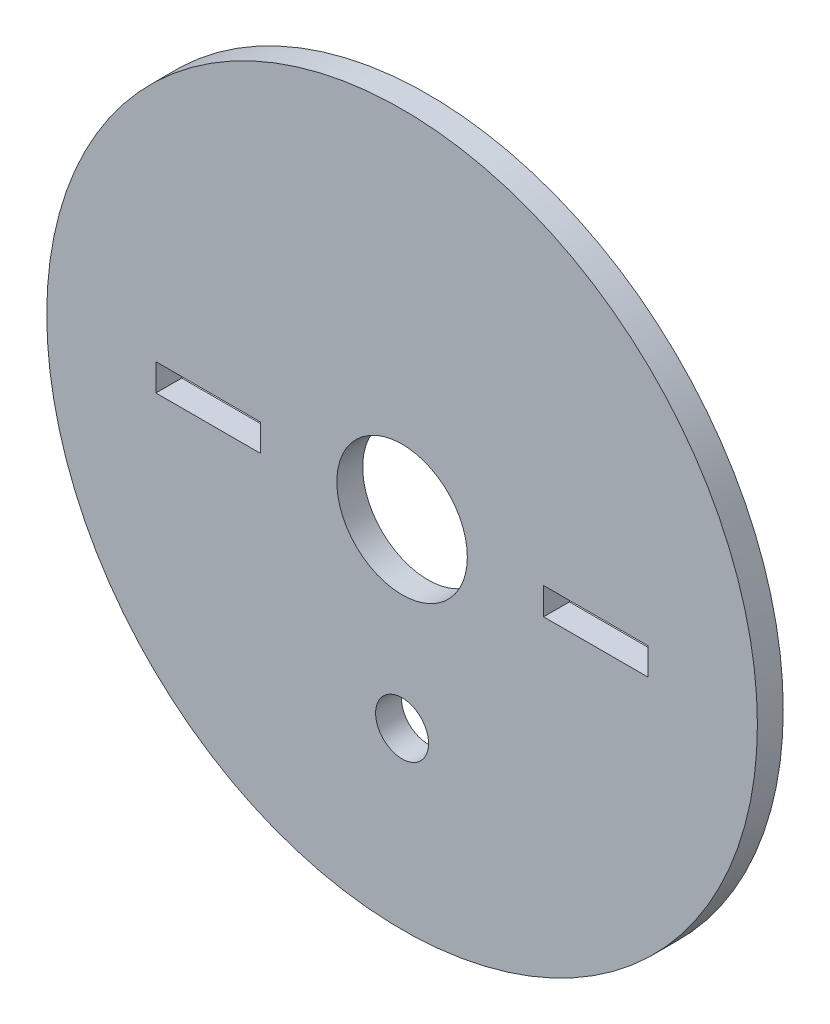
ISO-10303-21;
HEADER;
FILE_DESCRIPTION(('STEP AP214'),'2;1');
FILE_NAME('part.step','',(''),(''),'','','');
FILE_SCHEMA(('AUTOMOTIVE_DESIGN { 1 0 10303 214 1 1 1 1 }'));
ENDSEC;
DATA;
#1=APPLICATION_CONTEXT('core data for automotive mechanical design processes');
#2=APPLICATION_PROTOCOL_DEFINITION('international standard','automotive_design',2000,#1);
#3=PRODUCT_CONTEXT('',#1,'mechanical');
#4=PRODUCT('Part','Part','',(#3));
#5=PRODUCT_RELATED_PRODUCT_CATEGORY('part','',(#4));
#6=PRODUCT_DEFINITION_FORMATION('','',#4);
#7=PRODUCT_DEFINITION_CONTEXT('part definition',#1,'design');
#8=PRODUCT_DEFINITION('design','',#6,#7);
#9=PRODUCT_DEFINITION_SHAPE('','',#8);
#10=(LENGTH_UNIT() NAMED_UNIT(*) SI_UNIT(.MILLI.,.METRE.));
#11=(NAMED_UNIT(*) PLANE_ANGLE_UNIT() SI_UNIT($,.RADIAN.));
#12=(NAMED_UNIT(*) SI_UNIT($,.STERADIAN.) SOLID_ANGLE_UNIT());
#13=UNCERTAINTY_MEASURE_WITH_UNIT(LENGTH_MEASURE(1.E-05),#10,'distance_accuracy_value','');
#14=(GEOMETRIC_REPRESENTATION_CONTEXT(3) GLOBAL_UNCERTAINTY_ASSIGNED_CONTEXT((#13)) GLOBAL_UNIT_ASSIGNED_CONTEXT((#10,
#11,#12)) REPRESENTATION_CONTEXT('',''));
#15=CARTESIAN_POINT('',(0.,0.,0.));
#16=DIRECTION('',(0.,0.,1.));
#17=DIRECTION('',(1.,0.,0.));
#18=AXIS2_PLACEMENT_3D('',#15,#16,#17);
#19=CARTESIAN_POINT('',(0.,14.,2.));
#20=DIRECTION('',(0.,0.,1.));
#21=DIRECTION('',(1.,0.,0.));
#22=AXIS2_PLACEMENT_3D('',#19,#20,#21);
#23=PLANE('',#22);
#24=DIRECTION('',(0.,-1.,0.));
#25=VECTOR('',#24,1.);
#26=CARTESIAN_POINT('',(10.95,15.05,2.));
#27=LINE('',#26,#25);
#28=CARTESIAN_POINT('',(10.95,15.05,2.));
#29=VERTEX_POINT('',#28);
#30=CARTESIAN_POINT('',(10.95,12.95,2.));
#31=VERTEX_POINT('',#30);
#32=EDGE_CURVE('E108',#29,#31,#27,.T.);
#33=ORIENTED_EDGE('',*,*,#32,.F.);
#34=DIRECTION('',(-1.,0.,0.));
#35=VECTOR('',#34,1.);
#36=CARTESIAN_POINT('',(19.05,15.05,2.));
#37=LINE('',#36,#35);
#38=CARTESIAN_POINT('',(19.05,15.05,2.));
#39=VERTEX_POINT('',#38);
#40=EDGE_CURVE('E100',#39,#29,#37,.T.);
#41=ORIENTED_EDGE('',*,*,#40,.F.);
#42=DIRECTION('',(0.,1.,0.));
#43=VECTOR('',#42,1.);
#44=CARTESIAN_POINT('',(19.05,15.05,2.));
#45=LINE('',#44,#43);
#46=CARTESIAN_POINT('',(19.05,12.95,2.));
#47=VERTEX_POINT('',#46);
#48=EDGE_CURVE('E123',#47,#39,#45,.T.);
#49=ORIENTED_EDGE('',*,*,#48,.F.);
#50=DIRECTION('',(1.,0.,0.));
#51=VECTOR('',#50,1.);
#52=CARTESIAN_POINT('',(19.05,12.95,2.));
#53=LINE('',#52,#51);
#54=EDGE_CURVE('E121',#31,#47,#53,.T.);
#55=ORIENTED_EDGE('',*,*,#54,.F.);
#56=EDGE_LOOP('',(#33,#41,#49,#55));
#57=FACE_BOUND('',#56,.T.);
#58=DIRECTION('',(-1.,0.,0.));
#59=VECTOR('',#58,1.);
#60=CARTESIAN_POINT('',(-19.05,15.05,2.));
#61=LINE('',#60,#59);
#62=CARTESIAN_POINT('',(-10.95,15.05,2.));
#63=VERTEX_POINT('',#62);
#64=CARTESIAN_POINT('',(-19.05,15.05,2.));
#65=VERTEX_POINT('',#64);
#66=EDGE_CURVE('E141',#63,#65,#61,.T.);
#67=ORIENTED_EDGE('',*,*,#66,.F.);
#68=DIRECTION('',(0.,1.,0.));
#69=VECTOR('',#68,1.);
#70=CARTESIAN_POINT('',(-10.95,15.05,2.));
#71=LINE('',#70,#69);
#72=CARTESIAN_POINT('',(-10.95,12.95,2.));
#73=VERTEX_POINT('',#72);
#74=EDGE_CURVE('E139',#73,#63,#71,.T.);
#75=ORIENTED_EDGE('',*,*,#74,.F.);
#76=DIRECTION('',(1.,0.,0.));
#77=VECTOR('',#76,1.);
#78=CARTESIAN_POINT('',(-19.05,12.95,2.));
#79=LINE('',#78,#77);
#80=CARTESIAN_POINT('',(-19.05,12.95,2.));
#81=VERTEX_POINT('',#80);
#82=EDGE_CURVE('E147',#81,#73,#79,.T.);
#83=ORIENTED_EDGE('',*,*,#82,.F.);
#84=DIRECTION('',(0.,-1.,0.));
#85=VECTOR('',#84,1.);
#86=CARTESIAN_POINT('',(-19.05,15.05,2.));
#87=LINE('',#86,#85);
#88=EDGE_CURVE('E144',#65,#81,#87,.T.);
#89=ORIENTED_EDGE('',*,*,#88,.F.);
#90=EDGE_LOOP('',(#67,#75,#83,#89));
#91=FACE_BOUND('',#90,.T.);
#92=CARTESIAN_POINT('',(0.,0.,2.));
#93=DIRECTION('',(0.,0.,1.));
#94=DIRECTION('',(1.,0.,0.));
#95=AXIS2_PLACEMENT_3D('',#92,#93,#94);
#96=CIRCLE('',#95,2.05);
#97=CARTESIAN_POINT('',(2.05,0.,2.));
#98=VERTEX_POINT('',#97);
#99=EDGE_CURVE('E170',#98,#98,#96,.T.);
#100=ORIENTED_EDGE('',*,*,#99,.F.);
#101=EDGE_LOOP('',(#100));
#102=FACE_BOUND('',#101,.T.);
#103=CARTESIAN_POINT('',(0.,14.,2.));
#104=DIRECTION('',(0.,0.,1.));
#105=DIRECTION('',(1.,0.,0.));
#106=AXIS2_PLACEMENT_3D('',#103,#104,#105);
#107=CIRCLE('',#106,27.5);
#108=CARTESIAN_POINT('',(27.5,14.,2.));
#109=VERTEX_POINT('',#108);
#110=EDGE_CURVE('E11',#109,#109,#107,.T.);
#111=ORIENTED_EDGE('',*,*,#110,.T.);
#112=EDGE_LOOP('',(#111));
#113=FACE_BOUND('',#112,.T.);
#114=CARTESIAN_POINT('',(0.,14.,2.));
#115=DIRECTION('',(0.,0.,1.));
#116=DIRECTION('',(1.,0.,0.));
#117=AXIS2_PLACEMENT_3D('',#114,#115,#116);
#118=CIRCLE('',#117,5.05);
#119=CARTESIAN_POINT('',(5.05,14.,2.));
#120=VERTEX_POINT('',#119);
#121=EDGE_CURVE('E129',#120,#120,#118,.T.);
#122=ORIENTED_EDGE('',*,*,#121,.F.);
#123=EDGE_LOOP('',(#122));
#124=FACE_BOUND('',#123,.T.);
#125=ADVANCED_FACE('F35',(#57,#91,#102,#113,#124),#23,.T.);
#126=CARTESIAN_POINT('',(0.,14.,0.));
#127=DIRECTION('',(0.,0.,1.));
#128=DIRECTION('',(1.,0.,0.));
#129=AXIS2_PLACEMENT_3D('',#126,#127,#128);
#130=PLANE('',#129);
#131=DIRECTION('',(0.,1.,0.));
#132=VECTOR('',#131,1.);
#133=CARTESIAN_POINT('',(-10.95,15.05,0.));
#134=LINE('',#133,#132);
#135=CARTESIAN_POINT('',(-10.95,12.95,0.));
#136=VERTEX_POINT('',#135);
#137=CARTESIAN_POINT('',(-10.95,15.05,0.));
#138=VERTEX_POINT('',#137);
#139=EDGE_CURVE('E116',#136,#138,#134,.T.);
#140=ORIENTED_EDGE('',*,*,#139,.T.);
#141=DIRECTION('',(-1.,0.,0.));
#142=VECTOR('',#141,1.);
#143=CARTESIAN_POINT('',(-19.05,15.05,0.));
#144=LINE('',#143,#142);
#145=CARTESIAN_POINT('',(-19.05,15.05,0.));
#146=VERTEX_POINT('',#145);
#147=EDGE_CURVE('E152',#138,#146,#144,.T.);
#148=ORIENTED_EDGE('',*,*,#147,.T.);
#149=DIRECTION('',(0.,-1.,0.));
#150=VECTOR('',#149,1.);
#151=CARTESIAN_POINT('',(-19.05,15.05,0.));
#152=LINE('',#151,#150);
#153=CARTESIAN_POINT('',(-19.05,12.95,0.));
#154=VERTEX_POINT('',#153);
#155=EDGE_CURVE('E155',#146,#154,#152,.T.);
#156=ORIENTED_EDGE('',*,*,#155,.T.);
#157=DIRECTION('',(1.,0.,0.));
#158=VECTOR('',#157,1.);
#159=CARTESIAN_POINT('',(-19.05,12.95,0.));
#160=LINE('',#159,#158);
#161=EDGE_CURVE('E142',#154,#136,#160,.T.);
#162=ORIENTED_EDGE('',*,*,#161,.T.);
#163=EDGE_LOOP('',(#140,#148,#156,#162));
#164=FACE_BOUND('',#163,.T.);
#165=CARTESIAN_POINT('',(0.,14.,0.));
#166=DIRECTION('',(0.,0.,1.));
#167=DIRECTION('',(1.,0.,0.));
#168=AXIS2_PLACEMENT_3D('',#165,#166,#167);
#169=CIRCLE('',#168,27.5);
#170=CARTESIAN_POINT('',(27.5,14.,0.));
#171=VERTEX_POINT('',#170);
#172=EDGE_CURVE('E39',#171,#171,#169,.T.);
#173=ORIENTED_EDGE('',*,*,#172,.F.);
#174=EDGE_LOOP('',(#173));
#175=FACE_BOUND('',#174,.T.);
#176=CARTESIAN_POINT('',(0.,0.,0.));
#177=DIRECTION('',(0.,0.,1.));
#178=DIRECTION('',(1.,0.,0.));
#179=AXIS2_PLACEMENT_3D('',#176,#177,#178);
#180=CIRCLE('',#179,2.05);
#181=CARTESIAN_POINT('',(2.05,0.,0.));
#182=VERTEX_POINT('',#181);
#183=EDGE_CURVE('E169',#182,#182,#180,.T.);
#184=ORIENTED_EDGE('',*,*,#183,.T.);
#185=EDGE_LOOP('',(#184));
#186=FACE_BOUND('',#185,.T.);
#187=DIRECTION('',(-1.,0.,0.));
#188=VECTOR('',#187,1.);
#189=CARTESIAN_POINT('',(19.05,15.05,0.));
#190=LINE('',#189,#188);
#191=CARTESIAN_POINT('',(19.05,15.05,0.));
#192=VERTEX_POINT('',#191);
#193=CARTESIAN_POINT('',(10.95,15.05,0.));
#194=VERTEX_POINT('',#193);
#195=EDGE_CURVE('E58',#192,#194,#190,.T.);
#196=ORIENTED_EDGE('',*,*,#195,.T.);
#197=DIRECTION('',(0.,-1.,0.));
#198=VECTOR('',#197,1.);
#199=CARTESIAN_POINT('',(10.95,15.05,0.));
#200=LINE('',#199,#198);
#201=CARTESIAN_POINT('',(10.95,12.95,0.));
#202=VERTEX_POINT('',#201);
#203=EDGE_CURVE('E115',#194,#202,#200,.T.);
#204=ORIENTED_EDGE('',*,*,#203,.T.);
#205=DIRECTION('',(1.,0.,0.));
#206=VECTOR('',#205,1.);
#207=CARTESIAN_POINT('',(19.05,12.95,0.));
#208=LINE('',#207,#206);
#209=CARTESIAN_POINT('',(19.05,12.95,0.));
#210=VERTEX_POINT('',#209);
#211=EDGE_CURVE('E131',#202,#210,#208,.T.);
#212=ORIENTED_EDGE('',*,*,#211,.T.);
#213=DIRECTION('',(0.,1.,0.));
#214=VECTOR('',#213,1.);
#215=CARTESIAN_POINT('',(19.05,15.05,0.));
#216=LINE('',#215,#214);
#217=EDGE_CURVE('E109',#210,#192,#216,.T.);
#218=ORIENTED_EDGE('',*,*,#217,.T.);
#219=EDGE_LOOP('',(#196,#204,#212,#218));
#220=FACE_BOUND('',#219,.T.);
#221=CARTESIAN_POINT('',(0.,14.,0.));
#222=DIRECTION('',(0.,0.,1.));
#223=DIRECTION('',(1.,0.,0.));
#224=AXIS2_PLACEMENT_3D('',#221,#222,#223);
#225=CIRCLE('',#224,5.05);
#226=CARTESIAN_POINT('',(5.05,14.,0.));
#227=VERTEX_POINT('',#226);
#228=EDGE_CURVE('E249',#227,#227,#225,.T.);
#229=ORIENTED_EDGE('',*,*,#228,.T.);
#230=EDGE_LOOP('',(#229));
#231=FACE_BOUND('',#230,.T.);
#232=ADVANCED_FACE('F176',(#164,#175,#186,#220,#231),#130,.F.);
#233=CARTESIAN_POINT('',(0.,14.,2.));
#234=DIRECTION('',(0.,0.,-1.));
#235=DIRECTION('',(-1.,0.,0.));
#236=AXIS2_PLACEMENT_3D('',#233,#234,#235);
#237=CYLINDRICAL_SURFACE('',#236,27.5);
#238=ORIENTED_EDGE('',*,*,#110,.F.);
#239=EDGE_LOOP('',(#238));
#240=FACE_BOUND('',#239,.T.);
#241=ORIENTED_EDGE('',*,*,#172,.T.);
#242=EDGE_LOOP('',(#241));
#243=FACE_BOUND('',#242,.T.);
#244=ADVANCED_FACE('F37',(#240,#243),#237,.T.);
#245=CARTESIAN_POINT('',(0.,0.,2.));
#246=DIRECTION('',(0.,0.,-1.));
#247=DIRECTION('',(-1.,0.,0.));
#248=AXIS2_PLACEMENT_3D('',#245,#246,#247);
#249=CYLINDRICAL_SURFACE('',#248,2.05);
#250=ORIENTED_EDGE('',*,*,#99,.T.);
#251=EDGE_LOOP('',(#250));
#252=FACE_BOUND('',#251,.T.);
#253=ORIENTED_EDGE('',*,*,#183,.F.);
#254=EDGE_LOOP('',(#253));
#255=FACE_BOUND('',#254,.T.);
#256=ADVANCED_FACE('F179',(#252,#255),#249,.F.);
#257=CARTESIAN_POINT('',(-10.95,15.05,2.));
#258=DIRECTION('',(-1.,0.,0.));
#259=DIRECTION('',(0.,0.,1.));
#260=AXIS2_PLACEMENT_3D('',#257,#258,#259);
#261=PLANE('',#260);
#262=ORIENTED_EDGE('',*,*,#139,.F.);
#263=DIRECTION('',(0.,0.,-1.));
#264=VECTOR('',#263,1.);
#265=CARTESIAN_POINT('',(-10.95,12.95,2.));
#266=LINE('',#265,#264);
#267=EDGE_CURVE('E149',#73,#136,#266,.T.);
#268=ORIENTED_EDGE('',*,*,#267,.F.);
#269=ORIENTED_EDGE('',*,*,#74,.T.);
#270=DIRECTION('',(0.,0.,-1.));
#271=VECTOR('',#270,1.);
#272=CARTESIAN_POINT('',(-10.95,15.05,2.));
#273=LINE('',#272,#271);
#274=EDGE_CURVE('E166',#63,#138,#273,.T.);
#275=ORIENTED_EDGE('',*,*,#274,.T.);
#276=EDGE_LOOP('',(#262,#268,#269,#275));
#277=FACE_BOUND('',#276,.T.);
#278=ADVANCED_FACE('F181',(#277),#261,.T.);
#279=CARTESIAN_POINT('',(-19.05,15.05,2.));
#280=DIRECTION('',(0.,-1.,0.));
#281=DIRECTION('',(0.,0.,-1.));
#282=AXIS2_PLACEMENT_3D('',#279,#280,#281);
#283=PLANE('',#282);
#284=ORIENTED_EDGE('',*,*,#147,.F.);
#285=ORIENTED_EDGE('',*,*,#274,.F.);
#286=ORIENTED_EDGE('',*,*,#66,.T.);
#287=DIRECTION('',(0.,0.,-1.));
#288=VECTOR('',#287,1.);
#289=CARTESIAN_POINT('',(-19.05,15.05,2.));
#290=LINE('',#289,#288);
#291=EDGE_CURVE('E164',#65,#146,#290,.T.);
#292=ORIENTED_EDGE('',*,*,#291,.T.);
#293=EDGE_LOOP('',(#284,#285,#286,#292));
#294=FACE_BOUND('',#293,.T.);
#295=ADVANCED_FACE('F188',(#294),#283,.T.);
#296=CARTESIAN_POINT('',(-19.05,15.05,2.));
#297=DIRECTION('',(1.,0.,0.));
#298=DIRECTION('',(0.,0.,-1.));
#299=AXIS2_PLACEMENT_3D('',#296,#297,#298);
#300=PLANE('',#299);
#301=ORIENTED_EDGE('',*,*,#155,.F.);
#302=ORIENTED_EDGE('',*,*,#291,.F.);
#303=ORIENTED_EDGE('',*,*,#88,.T.);
#304=DIRECTION('',(0.,0.,-1.));
#305=VECTOR('',#304,1.);
#306=CARTESIAN_POINT('',(-19.05,12.95,2.));
#307=LINE('',#306,#305);
#308=EDGE_CURVE('E162',#81,#154,#307,.T.);
#309=ORIENTED_EDGE('',*,*,#308,.T.);
#310=EDGE_LOOP('',(#301,#302,#303,#309));
#311=FACE_BOUND('',#310,.T.);
#312=ADVANCED_FACE('F218',(#311),#300,.T.);
#313=CARTESIAN_POINT('',(-19.05,12.95,2.));
#314=DIRECTION('',(0.,1.,0.));
#315=DIRECTION('',(0.,0.,1.));
#316=AXIS2_PLACEMENT_3D('',#313,#314,#315);
#317=PLANE('',#316);
#318=ORIENTED_EDGE('',*,*,#161,.F.);
#319=ORIENTED_EDGE('',*,*,#308,.F.);
#320=ORIENTED_EDGE('',*,*,#82,.T.);
#321=ORIENTED_EDGE('',*,*,#267,.T.);
#322=EDGE_LOOP('',(#318,#319,#320,#321));
#323=FACE_BOUND('',#322,.T.);
#324=ADVANCED_FACE('F209',(#323),#317,.T.);
#325=CARTESIAN_POINT('',(19.05,15.05,2.));
#326=DIRECTION('',(0.,-1.,0.));
#327=DIRECTION('',(0.,0.,-1.));
#328=AXIS2_PLACEMENT_3D('',#325,#326,#327);
#329=PLANE('',#328);
#330=ORIENTED_EDGE('',*,*,#195,.F.);
#331=DIRECTION('',(0.,0.,-1.));
#332=VECTOR('',#331,1.);
#333=CARTESIAN_POINT('',(19.05,15.05,2.));
#334=LINE('',#333,#332);
#335=EDGE_CURVE('E104',#39,#192,#334,.T.);
#336=ORIENTED_EDGE('',*,*,#335,.F.);
#337=ORIENTED_EDGE('',*,*,#40,.T.);
#338=DIRECTION('',(0.,0.,-1.));
#339=VECTOR('',#338,1.);
#340=CARTESIAN_POINT('',(10.95,15.05,2.));
#341=LINE('',#340,#339);
#342=EDGE_CURVE('E103',#29,#194,#341,.T.);
#343=ORIENTED_EDGE('',*,*,#342,.T.);
#344=EDGE_LOOP('',(#330,#336,#337,#343));
#345=FACE_BOUND('',#344,.T.);
#346=ADVANCED_FACE('F102',(#345),#329,.T.);
#347=CARTESIAN_POINT('',(10.95,15.05,2.));
#348=DIRECTION('',(1.,0.,0.));
#349=DIRECTION('',(0.,0.,-1.));
#350=AXIS2_PLACEMENT_3D('',#347,#348,#349);
#351=PLANE('',#350);
#352=ORIENTED_EDGE('',*,*,#203,.F.);
#353=ORIENTED_EDGE('',*,*,#342,.F.);
#354=ORIENTED_EDGE('',*,*,#32,.T.);
#355=DIRECTION('',(0.,0.,-1.));
#356=VECTOR('',#355,1.);
#357=CARTESIAN_POINT('',(10.95,12.95,2.));
#358=LINE('',#357,#356);
#359=EDGE_CURVE('E117',#31,#202,#358,.T.);
#360=ORIENTED_EDGE('',*,*,#359,.T.);
#361=EDGE_LOOP('',(#352,#353,#354,#360));
#362=FACE_BOUND('',#361,.T.);
#363=ADVANCED_FACE('F112',(#362),#351,.T.);
#364=CARTESIAN_POINT('',(19.05,12.95,2.));
#365=DIRECTION('',(0.,1.,0.));
#366=DIRECTION('',(0.,0.,1.));
#367=AXIS2_PLACEMENT_3D('',#364,#365,#366);
#368=PLANE('',#367);
#369=ORIENTED_EDGE('',*,*,#211,.F.);
#370=ORIENTED_EDGE('',*,*,#359,.F.);
#371=ORIENTED_EDGE('',*,*,#54,.T.);
#372=DIRECTION('',(0.,0.,-1.));
#373=VECTOR('',#372,1.);
#374=CARTESIAN_POINT('',(19.05,12.95,2.));
#375=LINE('',#374,#373);
#376=EDGE_CURVE('E50',#47,#210,#375,.T.);
#377=ORIENTED_EDGE('',*,*,#376,.T.);
#378=EDGE_LOOP('',(#369,#370,#371,#377));
#379=FACE_BOUND('',#378,.T.);
#380=ADVANCED_FACE('F232',(#379),#368,.T.);
#381=CARTESIAN_POINT('',(19.05,15.05,2.));
#382=DIRECTION('',(-1.,0.,0.));
#383=DIRECTION('',(0.,0.,1.));
#384=AXIS2_PLACEMENT_3D('',#381,#382,#383);
#385=PLANE('',#384);
#386=ORIENTED_EDGE('',*,*,#217,.F.);
#387=ORIENTED_EDGE('',*,*,#376,.F.);
#388=ORIENTED_EDGE('',*,*,#48,.T.);
#389=ORIENTED_EDGE('',*,*,#335,.T.);
#390=EDGE_LOOP('',(#386,#387,#388,#389));
#391=FACE_BOUND('',#390,.T.);
#392=ADVANCED_FACE('F235',(#391),#385,.T.);
#393=CARTESIAN_POINT('',(0.,14.,2.));
#394=DIRECTION('',(0.,0.,-1.));
#395=DIRECTION('',(-1.,0.,0.));
#396=AXIS2_PLACEMENT_3D('',#393,#394,#395);
#397=CYLINDRICAL_SURFACE('',#396,5.05);
#398=ORIENTED_EDGE('',*,*,#121,.T.);
#399=EDGE_LOOP('',(#398));
#400=FACE_BOUND('',#399,.T.);
#401=ORIENTED_EDGE('',*,*,#228,.F.);
#402=EDGE_LOOP('',(#401));
#403=FACE_BOUND('',#402,.T.);
#404=ADVANCED_FACE('F239',(#400,#403),#397,.F.);
#405=CLOSED_SHELL('',(#125,#232,#244,#256,#278,#295,#312,#324,#346,#363,#380,#392,#404));
#406=MANIFOLD_SOLID_BREP('B2',#405);
#407=ADVANCED_BREP_SHAPE_REPRESENTATION('',(#18,#406),#14);
#408=SHAPE_DEFINITION_REPRESENTATION(#9,#407);
ENDSEC;
END-ISO-10303-21;
